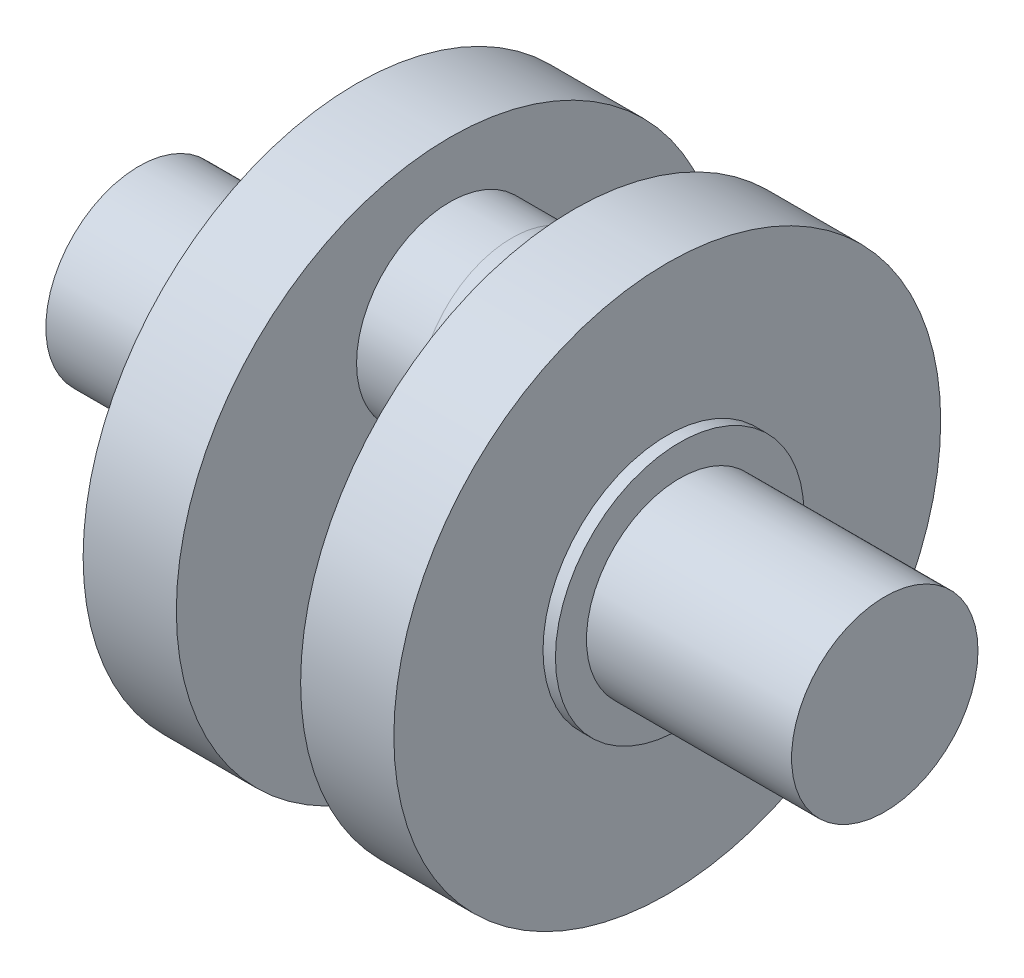
ISO-10303-21;
HEADER;
FILE_DESCRIPTION(('STEP AP214'),'2;1');
FILE_NAME('part.step','',(''),(''),'','','');
FILE_SCHEMA(('AUTOMOTIVE_DESIGN { 1 0 10303 214 1 1 1 1 }'));
ENDSEC;
DATA;
#1=APPLICATION_CONTEXT('core data for automotive mechanical design processes');
#2=APPLICATION_PROTOCOL_DEFINITION('international standard','automotive_design',2000,#1);
#3=PRODUCT_CONTEXT('',#1,'mechanical');
#4=PRODUCT('Part','Part','',(#3));
#5=PRODUCT_RELATED_PRODUCT_CATEGORY('part','',(#4));
#6=PRODUCT_DEFINITION_FORMATION('','',#4);
#7=PRODUCT_DEFINITION_CONTEXT('part definition',#1,'design');
#8=PRODUCT_DEFINITION('design','',#6,#7);
#9=PRODUCT_DEFINITION_SHAPE('','',#8);
#10=(LENGTH_UNIT() NAMED_UNIT(*) SI_UNIT(.MILLI.,.METRE.));
#11=(NAMED_UNIT(*) PLANE_ANGLE_UNIT() SI_UNIT($,.RADIAN.));
#12=(NAMED_UNIT(*) SI_UNIT($,.STERADIAN.) SOLID_ANGLE_UNIT());
#13=UNCERTAINTY_MEASURE_WITH_UNIT(LENGTH_MEASURE(1.E-05),#10,'distance_accuracy_value','');
#14=(GEOMETRIC_REPRESENTATION_CONTEXT(3) GLOBAL_UNCERTAINTY_ASSIGNED_CONTEXT((#13)) GLOBAL_UNIT_ASSIGNED_CONTEXT((#10,
#11,#12)) REPRESENTATION_CONTEXT('',''));
#15=CARTESIAN_POINT('',(0.,0.,0.));
#16=DIRECTION('',(0.,0.,1.));
#17=DIRECTION('',(1.,0.,0.));
#18=AXIS2_PLACEMENT_3D('',#15,#16,#17);
#19=CARTESIAN_POINT('',(-87.,0.,0.));
#20=DIRECTION('',(1.,0.,0.));
#21=DIRECTION('',(0.,0.,1.));
#22=AXIS2_PLACEMENT_3D('',#19,#20,#21);
#23=CYLINDRICAL_SURFACE('',#22,15.);
#24=CARTESIAN_POINT('',(-87.,0.,0.));
#25=DIRECTION('',(1.,0.,0.));
#26=DIRECTION('',(0.,0.,-1.));
#27=AXIS2_PLACEMENT_3D('',#24,#25,#26);
#28=CIRCLE('',#27,15.);
#29=CARTESIAN_POINT('',(-87.,0.,-15.));
#30=VERTEX_POINT('',#29);
#31=EDGE_CURVE('E11',#30,#30,#28,.T.);
#32=ORIENTED_EDGE('',*,*,#31,.T.);
#33=EDGE_LOOP('',(#32));
#34=FACE_BOUND('',#33,.T.);
#35=CARTESIAN_POINT('',(-54.,0.,0.));
#36=DIRECTION('',(1.,0.,0.));
#37=DIRECTION('',(0.,0.,-1.));
#38=AXIS2_PLACEMENT_3D('',#35,#36,#37);
#39=CIRCLE('',#38,15.);
#40=CARTESIAN_POINT('',(-54.,0.,-15.));
#41=VERTEX_POINT('',#40);
#42=EDGE_CURVE('E46',#41,#41,#39,.T.);
#43=ORIENTED_EDGE('',*,*,#42,.F.);
#44=EDGE_LOOP('',(#43));
#45=FACE_BOUND('',#44,.T.);
#46=ADVANCED_FACE('F43',(#34,#45),#23,.T.);
#47=CARTESIAN_POINT('',(-87.,0.,0.));
#48=DIRECTION('',(-1.,0.,0.));
#49=DIRECTION('',(0.,0.,-1.));
#50=AXIS2_PLACEMENT_3D('',#47,#48,#49);
#51=PLANE('',#50);
#52=ORIENTED_EDGE('',*,*,#31,.F.);
#53=EDGE_LOOP('',(#52));
#54=FACE_BOUND('',#53,.T.);
#55=ADVANCED_FACE('F85',(#54),#51,.T.);
#56=CARTESIAN_POINT('',(-52.,0.,0.));
#57=DIRECTION('',(-1.,0.,0.));
#58=DIRECTION('',(0.,0.,-1.));
#59=AXIS2_PLACEMENT_3D('',#56,#57,#58);
#60=CYLINDRICAL_SURFACE('',#59,20.);
#61=CARTESIAN_POINT('',(-52.,0.,0.));
#62=DIRECTION('',(1.,0.,0.));
#63=DIRECTION('',(0.,0.,-1.));
#64=AXIS2_PLACEMENT_3D('',#61,#62,#63);
#65=CIRCLE('',#64,20.);
#66=CARTESIAN_POINT('',(-52.,0.,-20.));
#67=VERTEX_POINT('',#66);
#68=EDGE_CURVE('E57',#67,#67,#65,.T.);
#69=ORIENTED_EDGE('',*,*,#68,.F.);
#70=EDGE_LOOP('',(#69));
#71=FACE_BOUND('',#70,.T.);
#72=CARTESIAN_POINT('',(-54.,0.,0.));
#73=DIRECTION('',(1.,0.,0.));
#74=DIRECTION('',(0.,0.,-1.));
#75=AXIS2_PLACEMENT_3D('',#72,#73,#74);
#76=CIRCLE('',#75,20.);
#77=CARTESIAN_POINT('',(-54.,0.,-20.));
#78=VERTEX_POINT('',#77);
#79=EDGE_CURVE('E53',#78,#78,#76,.T.);
#80=ORIENTED_EDGE('',*,*,#79,.T.);
#81=EDGE_LOOP('',(#80));
#82=FACE_BOUND('',#81,.T.);
#83=ADVANCED_FACE('F89',(#71,#82),#60,.T.);
#84=CARTESIAN_POINT('',(-54.,0.,0.));
#85=DIRECTION('',(-1.,0.,0.));
#86=DIRECTION('',(0.,0.,-1.));
#87=AXIS2_PLACEMENT_3D('',#84,#85,#86);
#88=PLANE('',#87);
#89=ORIENTED_EDGE('',*,*,#42,.T.);
#90=EDGE_LOOP('',(#89));
#91=FACE_BOUND('',#90,.T.);
#92=ORIENTED_EDGE('',*,*,#79,.F.);
#93=EDGE_LOOP('',(#92));
#94=FACE_BOUND('',#93,.T.);
#95=ADVANCED_FACE('F94',(#91,#94),#88,.T.);
#96=CARTESIAN_POINT('',(-37.,0.,0.));
#97=DIRECTION('',(-1.,0.,0.));
#98=DIRECTION('',(0.,0.,-1.));
#99=AXIS2_PLACEMENT_3D('',#96,#97,#98);
#100=CYLINDRICAL_SURFACE('',#99,44.);
#101=CARTESIAN_POINT('',(-37.,0.,0.));
#102=DIRECTION('',(-1.,0.,0.));
#103=DIRECTION('',(0.,0.,1.));
#104=AXIS2_PLACEMENT_3D('',#101,#102,#103);
#105=CIRCLE('',#104,44.);
#106=CARTESIAN_POINT('',(-37.,0.,44.));
#107=VERTEX_POINT('',#106);
#108=EDGE_CURVE('E60',#107,#107,#105,.T.);
#109=ORIENTED_EDGE('',*,*,#108,.T.);
#110=EDGE_LOOP('',(#109));
#111=FACE_BOUND('',#110,.T.);
#112=CARTESIAN_POINT('',(-52.,0.,0.));
#113=DIRECTION('',(-1.,0.,0.));
#114=DIRECTION('',(0.,0.,1.));
#115=AXIS2_PLACEMENT_3D('',#112,#113,#114);
#116=CIRCLE('',#115,44.);
#117=CARTESIAN_POINT('',(-52.,0.,44.));
#118=VERTEX_POINT('',#117);
#119=EDGE_CURVE('E61',#118,#118,#116,.T.);
#120=ORIENTED_EDGE('',*,*,#119,.F.);
#121=EDGE_LOOP('',(#120));
#122=FACE_BOUND('',#121,.T.);
#123=ADVANCED_FACE('F97',(#111,#122),#100,.T.);
#124=CARTESIAN_POINT('',(-37.,0.,0.));
#125=DIRECTION('',(1.,0.,0.));
#126=DIRECTION('',(0.,0.,1.));
#127=AXIS2_PLACEMENT_3D('',#124,#125,#126);
#128=PLANE('',#127);
#129=CARTESIAN_POINT('',(-37.,20.,0.));
#130=DIRECTION('',(-1.,0.,0.));
#131=DIRECTION('',(0.,0.,1.));
#132=AXIS2_PLACEMENT_3D('',#129,#130,#131);
#133=CIRCLE('',#132,15.);
#134=CARTESIAN_POINT('',(-37.,20.,15.));
#135=VERTEX_POINT('',#134);
#136=EDGE_CURVE('E67',#135,#135,#133,.T.);
#137=ORIENTED_EDGE('',*,*,#136,.T.);
#138=EDGE_LOOP('',(#137));
#139=FACE_BOUND('',#138,.T.);
#140=ORIENTED_EDGE('',*,*,#108,.F.);
#141=EDGE_LOOP('',(#140));
#142=FACE_BOUND('',#141,.T.);
#143=ADVANCED_FACE('F110',(#139,#142),#128,.T.);
#144=CARTESIAN_POINT('',(-52.,0.,0.));
#145=DIRECTION('',(1.,0.,0.));
#146=DIRECTION('',(0.,0.,1.));
#147=AXIS2_PLACEMENT_3D('',#144,#145,#146);
#148=PLANE('',#147);
#149=ORIENTED_EDGE('',*,*,#68,.T.);
#150=EDGE_LOOP('',(#149));
#151=FACE_BOUND('',#150,.T.);
#152=ORIENTED_EDGE('',*,*,#119,.T.);
#153=EDGE_LOOP('',(#152));
#154=FACE_BOUND('',#153,.T.);
#155=ADVANCED_FACE('F82',(#151,#154),#148,.F.);
#156=CARTESIAN_POINT('',(-27.,20.,0.));
#157=DIRECTION('',(-1.,0.,0.));
#158=DIRECTION('',(0.,0.,-1.));
#159=AXIS2_PLACEMENT_3D('',#156,#157,#158);
#160=CYLINDRICAL_SURFACE('',#159,15.);
#161=CARTESIAN_POINT('',(-27.,20.,0.));
#162=DIRECTION('',(-1.,0.,0.));
#163=DIRECTION('',(0.,0.,1.));
#164=AXIS2_PLACEMENT_3D('',#161,#162,#163);
#165=CIRCLE('',#164,15.);
#166=CARTESIAN_POINT('',(-27.,20.,15.));
#167=VERTEX_POINT('',#166);
#168=EDGE_CURVE('E64',#167,#167,#165,.T.);
#169=ORIENTED_EDGE('',*,*,#168,.T.);
#170=EDGE_LOOP('',(#169));
#171=FACE_BOUND('',#170,.T.);
#172=ORIENTED_EDGE('',*,*,#136,.F.);
#173=EDGE_LOOP('',(#172));
#174=FACE_BOUND('',#173,.T.);
#175=ADVANCED_FACE('F73',(#171,#174),#160,.T.);
#176=CARTESIAN_POINT('',(-27.,20.,0.));
#177=DIRECTION('',(1.,0.,0.));
#178=DIRECTION('',(0.,0.,1.));
#179=AXIS2_PLACEMENT_3D('',#176,#177,#178);
#180=PLANE('',#179);
#181=ORIENTED_EDGE('',*,*,#168,.F.);
#182=EDGE_LOOP('',(#181));
#183=FACE_BOUND('',#182,.T.);
#184=ADVANCED_FACE('F76',(#183),#180,.T.);
#185=CLOSED_SHELL('',(#46,#55,#83,#95,#123,#143,#155,#175,#184));
#186=MANIFOLD_SOLID_BREP('B2',#185);
#187=CARTESIAN_POINT('',(33.,0.,0.));
#188=DIRECTION('',(-1.,0.,0.));
#189=DIRECTION('',(0.,0.,1.));
#190=AXIS2_PLACEMENT_3D('',#187,#188,#189);
#191=CYLINDRICAL_SURFACE('',#190,15.);
#192=CARTESIAN_POINT('',(33.,0.,0.));
#193=DIRECTION('',(1.,0.,0.));
#194=DIRECTION('',(0.,0.,-1.));
#195=AXIS2_PLACEMENT_3D('',#192,#193,#194);
#196=CIRCLE('',#195,15.);
#197=CARTESIAN_POINT('',(33.,0.,-15.));
#198=VERTEX_POINT('',#197);
#199=EDGE_CURVE('E42',#198,#198,#196,.T.);
#200=ORIENTED_EDGE('',*,*,#199,.F.);
#201=EDGE_LOOP('',(#200));
#202=FACE_BOUND('',#201,.T.);
#203=CARTESIAN_POINT('',(0.,0.,0.));
#204=DIRECTION('',(1.,0.,0.));
#205=DIRECTION('',(0.,0.,-1.));
#206=AXIS2_PLACEMENT_3D('',#203,#204,#205);
#207=CIRCLE('',#206,15.);
#208=CARTESIAN_POINT('',(0.,0.,-15.));
#209=VERTEX_POINT('',#208);
#210=EDGE_CURVE('E195',#209,#209,#207,.T.);
#211=ORIENTED_EDGE('',*,*,#210,.T.);
#212=EDGE_LOOP('',(#211));
#213=FACE_BOUND('',#212,.T.);
#214=ADVANCED_FACE('F192',(#202,#213),#191,.T.);
#215=CARTESIAN_POINT('',(33.,0.,0.));
#216=DIRECTION('',(1.,0.,0.));
#217=DIRECTION('',(0.,0.,-1.));
#218=AXIS2_PLACEMENT_3D('',#215,#216,#217);
#219=PLANE('',#218);
#220=ORIENTED_EDGE('',*,*,#199,.T.);
#221=EDGE_LOOP('',(#220));
#222=FACE_BOUND('',#221,.T.);
#223=ADVANCED_FACE('F251',(#222),#219,.T.);
#224=CARTESIAN_POINT('',(-2.,0.,0.));
#225=DIRECTION('',(1.,0.,0.));
#226=DIRECTION('',(0.,0.,-1.));
#227=AXIS2_PLACEMENT_3D('',#224,#225,#226);
#228=CYLINDRICAL_SURFACE('',#227,20.);
#229=CARTESIAN_POINT('',(-2.,0.,0.));
#230=DIRECTION('',(1.,0.,0.));
#231=DIRECTION('',(0.,0.,-1.));
#232=AXIS2_PLACEMENT_3D('',#229,#230,#231);
#233=CIRCLE('',#232,20.);
#234=CARTESIAN_POINT('',(-2.,0.,-20.));
#235=VERTEX_POINT('',#234);
#236=EDGE_CURVE('E206',#235,#235,#233,.T.);
#237=ORIENTED_EDGE('',*,*,#236,.T.);
#238=EDGE_LOOP('',(#237));
#239=FACE_BOUND('',#238,.T.);
#240=CARTESIAN_POINT('',(0.,0.,0.));
#241=DIRECTION('',(1.,0.,0.));
#242=DIRECTION('',(0.,0.,-1.));
#243=AXIS2_PLACEMENT_3D('',#240,#241,#242);
#244=CIRCLE('',#243,20.);
#245=CARTESIAN_POINT('',(0.,0.,-20.));
#246=VERTEX_POINT('',#245);
#247=EDGE_CURVE('E202',#246,#246,#244,.T.);
#248=ORIENTED_EDGE('',*,*,#247,.F.);
#249=EDGE_LOOP('',(#248));
#250=FACE_BOUND('',#249,.T.);
#251=ADVANCED_FACE('F256',(#239,#250),#228,.T.);
#252=CARTESIAN_POINT('',(0.,0.,0.));
#253=DIRECTION('',(1.,0.,0.));
#254=DIRECTION('',(0.,0.,-1.));
#255=AXIS2_PLACEMENT_3D('',#252,#253,#254);
#256=PLANE('',#255);
#257=ORIENTED_EDGE('',*,*,#210,.F.);
#258=EDGE_LOOP('',(#257));
#259=FACE_BOUND('',#258,.T.);
#260=ORIENTED_EDGE('',*,*,#247,.T.);
#261=EDGE_LOOP('',(#260));
#262=FACE_BOUND('',#261,.T.);
#263=ADVANCED_FACE('F240',(#259,#262),#256,.T.);
#264=CARTESIAN_POINT('',(-17.,0.,0.));
#265=DIRECTION('',(1.,0.,0.));
#266=DIRECTION('',(0.,0.,-1.));
#267=AXIS2_PLACEMENT_3D('',#264,#265,#266);
#268=CYLINDRICAL_SURFACE('',#267,44.);
#269=CARTESIAN_POINT('',(-17.,0.,0.));
#270=DIRECTION('',(-1.,0.,0.));
#271=DIRECTION('',(0.,0.,1.));
#272=AXIS2_PLACEMENT_3D('',#269,#270,#271);
#273=CIRCLE('',#272,44.);
#274=CARTESIAN_POINT('',(-17.,0.,44.));
#275=VERTEX_POINT('',#274);
#276=EDGE_CURVE('E209',#275,#275,#273,.T.);
#277=ORIENTED_EDGE('',*,*,#276,.F.);
#278=EDGE_LOOP('',(#277));
#279=FACE_BOUND('',#278,.T.);
#280=CARTESIAN_POINT('',(-2.,0.,0.));
#281=DIRECTION('',(-1.,0.,0.));
#282=DIRECTION('',(0.,0.,1.));
#283=AXIS2_PLACEMENT_3D('',#280,#281,#282);
#284=CIRCLE('',#283,44.);
#285=CARTESIAN_POINT('',(-2.,0.,44.));
#286=VERTEX_POINT('',#285);
#287=EDGE_CURVE('E210',#286,#286,#284,.T.);
#288=ORIENTED_EDGE('',*,*,#287,.T.);
#289=EDGE_LOOP('',(#288));
#290=FACE_BOUND('',#289,.T.);
#291=ADVANCED_FACE('F234',(#279,#290),#268,.T.);
#292=CARTESIAN_POINT('',(-17.,0.,0.));
#293=DIRECTION('',(-1.,0.,0.));
#294=DIRECTION('',(0.,0.,1.));
#295=AXIS2_PLACEMENT_3D('',#292,#293,#294);
#296=PLANE('',#295);
#297=CARTESIAN_POINT('',(-17.,20.,0.));
#298=DIRECTION('',(-1.,0.,0.));
#299=DIRECTION('',(0.,0.,1.));
#300=AXIS2_PLACEMENT_3D('',#297,#298,#299);
#301=CIRCLE('',#300,15.);
#302=CARTESIAN_POINT('',(-17.,20.,15.));
#303=VERTEX_POINT('',#302);
#304=EDGE_CURVE('E216',#303,#303,#301,.T.);
#305=ORIENTED_EDGE('',*,*,#304,.F.);
#306=EDGE_LOOP('',(#305));
#307=FACE_BOUND('',#306,.T.);
#308=ORIENTED_EDGE('',*,*,#276,.T.);
#309=EDGE_LOOP('',(#308));
#310=FACE_BOUND('',#309,.T.);
#311=ADVANCED_FACE('F231',(#307,#310),#296,.T.);
#312=CARTESIAN_POINT('',(-2.,0.,0.));
#313=DIRECTION('',(-1.,0.,0.));
#314=DIRECTION('',(0.,0.,1.));
#315=AXIS2_PLACEMENT_3D('',#312,#313,#314);
#316=PLANE('',#315);
#317=ORIENTED_EDGE('',*,*,#236,.F.);
#318=EDGE_LOOP('',(#317));
#319=FACE_BOUND('',#318,.T.);
#320=ORIENTED_EDGE('',*,*,#287,.F.);
#321=EDGE_LOOP('',(#320));
#322=FACE_BOUND('',#321,.T.);
#323=ADVANCED_FACE('F227',(#319,#322),#316,.F.);
#324=CARTESIAN_POINT('',(-27.,20.,0.));
#325=DIRECTION('',(1.,0.,0.));
#326=DIRECTION('',(0.,0.,-1.));
#327=AXIS2_PLACEMENT_3D('',#324,#325,#326);
#328=CYLINDRICAL_SURFACE('',#327,15.);
#329=CARTESIAN_POINT('',(-27.,20.,0.));
#330=DIRECTION('',(-1.,0.,0.));
#331=DIRECTION('',(0.,0.,1.));
#332=AXIS2_PLACEMENT_3D('',#329,#330,#331);
#333=CIRCLE('',#332,15.);
#334=CARTESIAN_POINT('',(-27.,20.,15.));
#335=VERTEX_POINT('',#334);
#336=EDGE_CURVE('E213',#335,#335,#333,.T.);
#337=ORIENTED_EDGE('',*,*,#336,.F.);
#338=EDGE_LOOP('',(#337));
#339=FACE_BOUND('',#338,.T.);
#340=ORIENTED_EDGE('',*,*,#304,.T.);
#341=EDGE_LOOP('',(#340));
#342=FACE_BOUND('',#341,.T.);
#343=ADVANCED_FACE('F224',(#339,#342),#328,.T.);
#344=CARTESIAN_POINT('',(-27.,20.,0.));
#345=DIRECTION('',(-1.,0.,0.));
#346=DIRECTION('',(0.,0.,1.));
#347=AXIS2_PLACEMENT_3D('',#344,#345,#346);
#348=PLANE('',#347);
#349=ORIENTED_EDGE('',*,*,#336,.T.);
#350=EDGE_LOOP('',(#349));
#351=FACE_BOUND('',#350,.T.);
#352=ADVANCED_FACE('F222',(#351),#348,.T.);
#353=CLOSED_SHELL('',(#214,#223,#251,#263,#291,#311,#323,#343,#352));
#354=MANIFOLD_SOLID_BREP('B6',#353);
#355=ADVANCED_BREP_SHAPE_REPRESENTATION('',(#18,#186,#354),#14);
#356=SHAPE_DEFINITION_REPRESENTATION(#9,#355);
ENDSEC;
END-ISO-10303-21;
